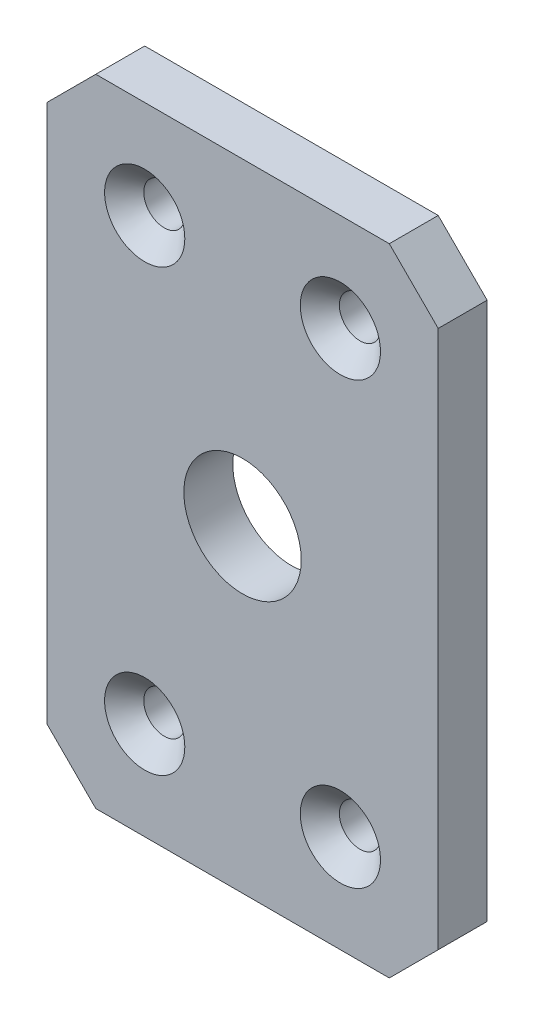
ISO-10303-21;
HEADER;
FILE_DESCRIPTION(('STEP AP214'),'2;1');
FILE_NAME('part.step','',(''),(''),'','','');
FILE_SCHEMA(('AUTOMOTIVE_DESIGN { 1 0 10303 214 1 1 1 1 }'));
ENDSEC;
DATA;
#1=APPLICATION_CONTEXT('core data for automotive mechanical design processes');
#2=APPLICATION_PROTOCOL_DEFINITION('international standard','automotive_design',2000,#1);
#3=PRODUCT_CONTEXT('',#1,'mechanical');
#4=PRODUCT('Part','Part','',(#3));
#5=PRODUCT_RELATED_PRODUCT_CATEGORY('part','',(#4));
#6=PRODUCT_DEFINITION_FORMATION('','',#4);
#7=PRODUCT_DEFINITION_CONTEXT('part definition',#1,'design');
#8=PRODUCT_DEFINITION('design','',#6,#7);
#9=PRODUCT_DEFINITION_SHAPE('','',#8);
#10=(LENGTH_UNIT() NAMED_UNIT(*) SI_UNIT(.MILLI.,.METRE.));
#11=(NAMED_UNIT(*) PLANE_ANGLE_UNIT() SI_UNIT($,.RADIAN.));
#12=(NAMED_UNIT(*) SI_UNIT($,.STERADIAN.) SOLID_ANGLE_UNIT());
#13=UNCERTAINTY_MEASURE_WITH_UNIT(LENGTH_MEASURE(1.E-05),#10,'distance_accuracy_value','');
#14=(GEOMETRIC_REPRESENTATION_CONTEXT(3) GLOBAL_UNCERTAINTY_ASSIGNED_CONTEXT((#13)) GLOBAL_UNIT_ASSIGNED_CONTEXT((#10,
#11,#12)) REPRESENTATION_CONTEXT('',''));
#15=CARTESIAN_POINT('',(0.,0.,0.));
#16=DIRECTION('',(0.,0.,1.));
#17=DIRECTION('',(1.,0.,0.));
#18=AXIS2_PLACEMENT_3D('',#15,#16,#17);
#19=CARTESIAN_POINT('',(0.,0.,2.5));
#20=DIRECTION('',(0.,0.,1.));
#21=DIRECTION('',(1.,0.,0.));
#22=AXIS2_PLACEMENT_3D('',#19,#20,#21);
#23=PLANE('',#22);
#24=CARTESIAN_POINT('',(10.,-22.5,2.5));
#25=DIRECTION('',(0.,0.,1.));
#26=DIRECTION('',(1.,0.,0.));
#27=AXIS2_PLACEMENT_3D('',#24,#25,#26);
#28=CIRCLE('',#27,4.09999999999999);
#29=CARTESIAN_POINT('',(14.1,-22.5,2.5));
#30=VERTEX_POINT('',#29);
#31=EDGE_CURVE('E162',#30,#30,#28,.F.);
#32=ORIENTED_EDGE('',*,*,#31,.T.);
#33=EDGE_LOOP('',(#32));
#34=FACE_BOUND('',#33,.T.);
#35=CARTESIAN_POINT('',(-10.,-22.5,2.5));
#36=DIRECTION('',(0.,0.,1.));
#37=DIRECTION('',(1.,0.,0.));
#38=AXIS2_PLACEMENT_3D('',#35,#36,#37);
#39=CIRCLE('',#38,4.09999999999999);
#40=CARTESIAN_POINT('',(-5.90000000000001,-22.5,2.5));
#41=VERTEX_POINT('',#40);
#42=EDGE_CURVE('E159',#41,#41,#39,.F.);
#43=ORIENTED_EDGE('',*,*,#42,.T.);
#44=EDGE_LOOP('',(#43));
#45=FACE_BOUND('',#44,.T.);
#46=CARTESIAN_POINT('',(10.,22.5,2.5));
#47=DIRECTION('',(0.,0.,1.));
#48=DIRECTION('',(1.,0.,0.));
#49=AXIS2_PLACEMENT_3D('',#46,#47,#48);
#50=CIRCLE('',#49,4.09999999999999);
#51=CARTESIAN_POINT('',(14.1,22.5,2.5));
#52=VERTEX_POINT('',#51);
#53=EDGE_CURVE('E156',#52,#52,#50,.F.);
#54=ORIENTED_EDGE('',*,*,#53,.T.);
#55=EDGE_LOOP('',(#54));
#56=FACE_BOUND('',#55,.T.);
#57=CARTESIAN_POINT('',(-10.,22.5,2.5));
#58=DIRECTION('',(0.,0.,1.));
#59=DIRECTION('',(1.,0.,0.));
#60=AXIS2_PLACEMENT_3D('',#57,#58,#59);
#61=CIRCLE('',#60,4.09999999999999);
#62=CARTESIAN_POINT('',(-5.90000000000001,22.5,2.5));
#63=VERTEX_POINT('',#62);
#64=EDGE_CURVE('E153',#63,#63,#61,.F.);
#65=ORIENTED_EDGE('',*,*,#64,.T.);
#66=EDGE_LOOP('',(#65));
#67=FACE_BOUND('',#66,.T.);
#68=DIRECTION('',(0.,1.,0.));
#69=VECTOR('',#68,1.);
#70=CARTESIAN_POINT('',(20.,-32.5,2.5));
#71=LINE('',#70,#69);
#72=CARTESIAN_POINT('',(20.,-27.5,2.5));
#73=VERTEX_POINT('',#72);
#74=CARTESIAN_POINT('',(20.,27.5,2.5));
#75=VERTEX_POINT('',#74);
#76=EDGE_CURVE('E212',#73,#75,#71,.T.);
#77=ORIENTED_EDGE('',*,*,#76,.T.);
#78=DIRECTION('',(0.707106781186546,-0.707106781186549,0.));
#79=VECTOR('',#78,1.);
#80=CARTESIAN_POINT('',(23.75,23.7499999999999,2.5));
#81=LINE('',#80,#79);
#82=CARTESIAN_POINT('',(15.,32.5,2.5));
#83=VERTEX_POINT('',#82);
#84=EDGE_CURVE('E190',#75,#83,#81,.F.);
#85=ORIENTED_EDGE('',*,*,#84,.T.);
#86=DIRECTION('',(-1.,0.,0.));
#87=VECTOR('',#86,1.);
#88=CARTESIAN_POINT('',(20.,32.5,2.5));
#89=LINE('',#88,#87);
#90=CARTESIAN_POINT('',(-15.,32.5,2.5));
#91=VERTEX_POINT('',#90);
#92=EDGE_CURVE('E124',#83,#91,#89,.T.);
#93=ORIENTED_EDGE('',*,*,#92,.T.);
#94=DIRECTION('',(0.707106781186548,0.707106781186548,0.));
#95=VECTOR('',#94,1.);
#96=CARTESIAN_POINT('',(-23.75,23.75,2.5));
#97=LINE('',#96,#95);
#98=CARTESIAN_POINT('',(-20.,27.5,2.5));
#99=VERTEX_POINT('',#98);
#100=EDGE_CURVE('E185',#91,#99,#97,.F.);
#101=ORIENTED_EDGE('',*,*,#100,.T.);
#102=DIRECTION('',(0.,-1.,0.));
#103=VECTOR('',#102,1.);
#104=CARTESIAN_POINT('',(-20.,-32.5,2.5));
#105=LINE('',#104,#103);
#106=CARTESIAN_POINT('',(-20.,-27.5,2.5));
#107=VERTEX_POINT('',#106);
#108=EDGE_CURVE('E131',#99,#107,#105,.T.);
#109=ORIENTED_EDGE('',*,*,#108,.T.);
#110=DIRECTION('',(-0.707106781186547,0.707106781186548,0.));
#111=VECTOR('',#110,1.);
#112=CARTESIAN_POINT('',(-23.75,-23.75,2.5));
#113=LINE('',#112,#111);
#114=CARTESIAN_POINT('',(-15.,-32.5,2.5));
#115=VERTEX_POINT('',#114);
#116=EDGE_CURVE('E60',#107,#115,#113,.F.);
#117=ORIENTED_EDGE('',*,*,#116,.T.);
#118=DIRECTION('',(1.,0.,0.));
#119=VECTOR('',#118,1.);
#120=CARTESIAN_POINT('',(20.,-32.5,2.5));
#121=LINE('',#120,#119);
#122=CARTESIAN_POINT('',(15.,-32.5,2.5));
#123=VERTEX_POINT('',#122);
#124=EDGE_CURVE('E134',#115,#123,#121,.T.);
#125=ORIENTED_EDGE('',*,*,#124,.T.);
#126=DIRECTION('',(-0.707106781186548,-0.707106781186547,0.));
#127=VECTOR('',#126,1.);
#128=CARTESIAN_POINT('',(23.75,-23.75,2.5));
#129=LINE('',#128,#127);
#130=EDGE_CURVE('E188',#123,#73,#129,.F.);
#131=ORIENTED_EDGE('',*,*,#130,.T.);
#132=EDGE_LOOP('',(#77,#85,#93,#101,#109,#117,#125,#131));
#133=FACE_BOUND('',#132,.T.);
#134=CARTESIAN_POINT('',(0.,0.,2.5));
#135=DIRECTION('',(0.,0.,1.));
#136=DIRECTION('',(1.,0.,0.));
#137=AXIS2_PLACEMENT_3D('',#134,#135,#136);
#138=CIRCLE('',#137,6.);
#139=CARTESIAN_POINT('',(6.,0.,2.5));
#140=VERTEX_POINT('',#139);
#141=EDGE_CURVE('E206',#140,#140,#138,.T.);
#142=ORIENTED_EDGE('',*,*,#141,.F.);
#143=EDGE_LOOP('',(#142));
#144=FACE_BOUND('',#143,.T.);
#145=ADVANCED_FACE('F37',(#34,#45,#56,#67,#133,#144),#23,.T.);
#146=CARTESIAN_POINT('',(0.,0.,-2.5));
#147=DIRECTION('',(0.,0.,1.));
#148=DIRECTION('',(1.,0.,0.));
#149=AXIS2_PLACEMENT_3D('',#146,#147,#148);
#150=PLANE('',#149);
#151=CARTESIAN_POINT('',(10.,-22.5,-2.5));
#152=DIRECTION('',(0.,0.,1.));
#153=DIRECTION('',(1.,0.,0.));
#154=AXIS2_PLACEMENT_3D('',#151,#152,#153);
#155=CIRCLE('',#154,2.1);
#156=CARTESIAN_POINT('',(12.1,-22.5,-2.5));
#157=VERTEX_POINT('',#156);
#158=EDGE_CURVE('E149',#157,#157,#155,.T.);
#159=ORIENTED_EDGE('',*,*,#158,.T.);
#160=EDGE_LOOP('',(#159));
#161=FACE_BOUND('',#160,.T.);
#162=CARTESIAN_POINT('',(-10.,-22.5,-2.5));
#163=DIRECTION('',(0.,0.,1.));
#164=DIRECTION('',(1.,0.,0.));
#165=AXIS2_PLACEMENT_3D('',#162,#163,#164);
#166=CIRCLE('',#165,2.1);
#167=CARTESIAN_POINT('',(-7.9,-22.5,-2.5));
#168=VERTEX_POINT('',#167);
#169=EDGE_CURVE('E146',#168,#168,#166,.T.);
#170=ORIENTED_EDGE('',*,*,#169,.T.);
#171=EDGE_LOOP('',(#170));
#172=FACE_BOUND('',#171,.T.);
#173=CARTESIAN_POINT('',(-10.,22.5,-2.5));
#174=DIRECTION('',(0.,0.,1.));
#175=DIRECTION('',(1.,0.,0.));
#176=AXIS2_PLACEMENT_3D('',#173,#174,#175);
#177=CIRCLE('',#176,2.1);
#178=CARTESIAN_POINT('',(-7.9,22.5,-2.5));
#179=VERTEX_POINT('',#178);
#180=EDGE_CURVE('E143',#179,#179,#177,.T.);
#181=ORIENTED_EDGE('',*,*,#180,.T.);
#182=EDGE_LOOP('',(#181));
#183=FACE_BOUND('',#182,.T.);
#184=CARTESIAN_POINT('',(10.,22.5,-2.5));
#185=DIRECTION('',(0.,0.,1.));
#186=DIRECTION('',(1.,0.,0.));
#187=AXIS2_PLACEMENT_3D('',#184,#185,#186);
#188=CIRCLE('',#187,2.1);
#189=CARTESIAN_POINT('',(12.1,22.5,-2.5));
#190=VERTEX_POINT('',#189);
#191=EDGE_CURVE('E140',#190,#190,#188,.T.);
#192=ORIENTED_EDGE('',*,*,#191,.T.);
#193=EDGE_LOOP('',(#192));
#194=FACE_BOUND('',#193,.T.);
#195=DIRECTION('',(-1.,0.,0.));
#196=VECTOR('',#195,1.);
#197=CARTESIAN_POINT('',(20.,32.5,-2.5));
#198=LINE('',#197,#196);
#199=CARTESIAN_POINT('',(15.,32.5,-2.5));
#200=VERTEX_POINT('',#199);
#201=CARTESIAN_POINT('',(-15.,32.5,-2.5));
#202=VERTEX_POINT('',#201);
#203=EDGE_CURVE('E121',#200,#202,#198,.T.);
#204=ORIENTED_EDGE('',*,*,#203,.F.);
#205=DIRECTION('',(-0.707106781186546,0.707106781186549,0.));
#206=VECTOR('',#205,1.);
#207=CARTESIAN_POINT('',(15.,32.5,-2.5));
#208=LINE('',#207,#206);
#209=CARTESIAN_POINT('',(20.,27.5,-2.5));
#210=VERTEX_POINT('',#209);
#211=EDGE_CURVE('E104',#200,#210,#208,.F.);
#212=ORIENTED_EDGE('',*,*,#211,.T.);
#213=DIRECTION('',(0.,1.,0.));
#214=VECTOR('',#213,1.);
#215=CARTESIAN_POINT('',(20.,-32.5,-2.5));
#216=LINE('',#215,#214);
#217=CARTESIAN_POINT('',(20.,-27.5,-2.5));
#218=VERTEX_POINT('',#217);
#219=EDGE_CURVE('E132',#218,#210,#216,.T.);
#220=ORIENTED_EDGE('',*,*,#219,.F.);
#221=DIRECTION('',(0.707106781186548,0.707106781186547,0.));
#222=VECTOR('',#221,1.);
#223=CARTESIAN_POINT('',(20.,-27.5,-2.5));
#224=LINE('',#223,#222);
#225=CARTESIAN_POINT('',(15.,-32.5,-2.5));
#226=VERTEX_POINT('',#225);
#227=EDGE_CURVE('E115',#218,#226,#224,.F.);
#228=ORIENTED_EDGE('',*,*,#227,.T.);
#229=DIRECTION('',(1.,0.,0.));
#230=VECTOR('',#229,1.);
#231=CARTESIAN_POINT('',(20.,-32.5,-2.5));
#232=LINE('',#231,#230);
#233=CARTESIAN_POINT('',(-15.,-32.5,-2.5));
#234=VERTEX_POINT('',#233);
#235=EDGE_CURVE('E136',#234,#226,#232,.T.);
#236=ORIENTED_EDGE('',*,*,#235,.F.);
#237=DIRECTION('',(0.707106781186547,-0.707106781186548,0.));
#238=VECTOR('',#237,1.);
#239=CARTESIAN_POINT('',(-15.,-32.5,-2.5));
#240=LINE('',#239,#238);
#241=CARTESIAN_POINT('',(-20.,-27.5,-2.5));
#242=VERTEX_POINT('',#241);
#243=EDGE_CURVE('E179',#234,#242,#240,.F.);
#244=ORIENTED_EDGE('',*,*,#243,.T.);
#245=DIRECTION('',(0.,-1.,0.));
#246=VECTOR('',#245,1.);
#247=CARTESIAN_POINT('',(-20.,-32.5,-2.5));
#248=LINE('',#247,#246);
#249=CARTESIAN_POINT('',(-20.,27.5,-2.5));
#250=VERTEX_POINT('',#249);
#251=EDGE_CURVE('E201',#250,#242,#248,.T.);
#252=ORIENTED_EDGE('',*,*,#251,.F.);
#253=DIRECTION('',(-0.707106781186548,-0.707106781186548,0.));
#254=VECTOR('',#253,1.);
#255=CARTESIAN_POINT('',(-20.,27.5,-2.5));
#256=LINE('',#255,#254);
#257=EDGE_CURVE('E125',#250,#202,#256,.F.);
#258=ORIENTED_EDGE('',*,*,#257,.T.);
#259=EDGE_LOOP('',(#204,#212,#220,#228,#236,#244,#252,#258));
#260=FACE_BOUND('',#259,.T.);
#261=CARTESIAN_POINT('',(0.,0.,-2.5));
#262=DIRECTION('',(0.,0.,1.));
#263=DIRECTION('',(1.,0.,0.));
#264=AXIS2_PLACEMENT_3D('',#261,#262,#263);
#265=CIRCLE('',#264,6.);
#266=CARTESIAN_POINT('',(6.,0.,-2.5));
#267=VERTEX_POINT('',#266);
#268=EDGE_CURVE('E152',#267,#267,#265,.T.);
#269=ORIENTED_EDGE('',*,*,#268,.T.);
#270=EDGE_LOOP('',(#269));
#271=FACE_BOUND('',#270,.T.);
#272=ADVANCED_FACE('F128',(#161,#172,#183,#194,#260,#271),#150,.F.);
#273=CARTESIAN_POINT('',(-20.,-32.5,2.5));
#274=DIRECTION('',(1.,0.,0.));
#275=DIRECTION('',(0.,0.,-1.));
#276=AXIS2_PLACEMENT_3D('',#273,#274,#275);
#277=PLANE('',#276);
#278=ORIENTED_EDGE('',*,*,#251,.T.);
#279=DIRECTION('',(0.,0.,1.));
#280=VECTOR('',#279,1.);
#281=CARTESIAN_POINT('',(-20.,-27.5,2.5));
#282=LINE('',#281,#280);
#283=EDGE_CURVE('E11',#242,#107,#282,.T.);
#284=ORIENTED_EDGE('',*,*,#283,.T.);
#285=ORIENTED_EDGE('',*,*,#108,.F.);
#286=DIRECTION('',(0.,0.,-1.));
#287=VECTOR('',#286,1.);
#288=CARTESIAN_POINT('',(-20.,27.5,2.5));
#289=LINE('',#288,#287);
#290=EDGE_CURVE('E46',#99,#250,#289,.T.);
#291=ORIENTED_EDGE('',*,*,#290,.T.);
#292=EDGE_LOOP('',(#278,#284,#285,#291));
#293=FACE_BOUND('',#292,.T.);
#294=ADVANCED_FACE('F200',(#293),#277,.F.);
#295=CARTESIAN_POINT('',(20.,-32.5,2.5));
#296=DIRECTION('',(0.,1.,0.));
#297=DIRECTION('',(-1.,0.,0.));
#298=AXIS2_PLACEMENT_3D('',#295,#296,#297);
#299=PLANE('',#298);
#300=ORIENTED_EDGE('',*,*,#235,.T.);
#301=DIRECTION('',(0.,0.,1.));
#302=VECTOR('',#301,1.);
#303=CARTESIAN_POINT('',(15.,-32.5,2.5));
#304=LINE('',#303,#302);
#305=EDGE_CURVE('E53',#226,#123,#304,.T.);
#306=ORIENTED_EDGE('',*,*,#305,.T.);
#307=ORIENTED_EDGE('',*,*,#124,.F.);
#308=DIRECTION('',(0.,0.,-1.));
#309=VECTOR('',#308,1.);
#310=CARTESIAN_POINT('',(-15.,-32.5,2.5));
#311=LINE('',#310,#309);
#312=EDGE_CURVE('E192',#115,#234,#311,.T.);
#313=ORIENTED_EDGE('',*,*,#312,.T.);
#314=EDGE_LOOP('',(#300,#306,#307,#313));
#315=FACE_BOUND('',#314,.T.);
#316=ADVANCED_FACE('F245',(#315),#299,.F.);
#317=CARTESIAN_POINT('',(20.,-32.5,2.5));
#318=DIRECTION('',(-1.,0.,0.));
#319=DIRECTION('',(0.,0.,1.));
#320=AXIS2_PLACEMENT_3D('',#317,#318,#319);
#321=PLANE('',#320);
#322=ORIENTED_EDGE('',*,*,#219,.T.);
#323=DIRECTION('',(0.,0.,1.));
#324=VECTOR('',#323,1.);
#325=CARTESIAN_POINT('',(20.,27.5,2.5));
#326=LINE('',#325,#324);
#327=EDGE_CURVE('E109',#210,#75,#326,.T.);
#328=ORIENTED_EDGE('',*,*,#327,.T.);
#329=ORIENTED_EDGE('',*,*,#76,.F.);
#330=DIRECTION('',(0.,0.,-1.));
#331=VECTOR('',#330,1.);
#332=CARTESIAN_POINT('',(20.,-27.5,2.5));
#333=LINE('',#332,#331);
#334=EDGE_CURVE('E114',#73,#218,#333,.T.);
#335=ORIENTED_EDGE('',*,*,#334,.T.);
#336=EDGE_LOOP('',(#322,#328,#329,#335));
#337=FACE_BOUND('',#336,.T.);
#338=ADVANCED_FACE('F231',(#337),#321,.F.);
#339=CARTESIAN_POINT('',(20.,32.5,2.5));
#340=DIRECTION('',(0.,-1.,0.));
#341=DIRECTION('',(1.,0.,0.));
#342=AXIS2_PLACEMENT_3D('',#339,#340,#341);
#343=PLANE('',#342);
#344=ORIENTED_EDGE('',*,*,#92,.F.);
#345=DIRECTION('',(0.,0.,-1.));
#346=VECTOR('',#345,1.);
#347=CARTESIAN_POINT('',(15.,32.5,2.5));
#348=LINE('',#347,#346);
#349=EDGE_CURVE('E108',#83,#200,#348,.T.);
#350=ORIENTED_EDGE('',*,*,#349,.T.);
#351=ORIENTED_EDGE('',*,*,#203,.T.);
#352=DIRECTION('',(0.,0.,1.));
#353=VECTOR('',#352,1.);
#354=CARTESIAN_POINT('',(-15.,32.5,2.5));
#355=LINE('',#354,#353);
#356=EDGE_CURVE('E126',#202,#91,#355,.T.);
#357=ORIENTED_EDGE('',*,*,#356,.T.);
#358=EDGE_LOOP('',(#344,#350,#351,#357));
#359=FACE_BOUND('',#358,.T.);
#360=ADVANCED_FACE('F120',(#359),#343,.F.);
#361=CARTESIAN_POINT('',(0.,0.,2.5));
#362=DIRECTION('',(0.,0.,-1.));
#363=DIRECTION('',(-1.,0.,0.));
#364=AXIS2_PLACEMENT_3D('',#361,#362,#363);
#365=CYLINDRICAL_SURFACE('',#364,6.);
#366=ORIENTED_EDGE('',*,*,#141,.T.);
#367=EDGE_LOOP('',(#366));
#368=FACE_BOUND('',#367,.T.);
#369=ORIENTED_EDGE('',*,*,#268,.F.);
#370=EDGE_LOOP('',(#369));
#371=FACE_BOUND('',#370,.T.);
#372=ADVANCED_FACE('F219',(#368,#371),#365,.F.);
#373=CARTESIAN_POINT('',(10.,22.5,2.5));
#374=DIRECTION('',(0.,0.,-1.));
#375=DIRECTION('',(-1.,0.,0.));
#376=AXIS2_PLACEMENT_3D('',#373,#374,#375);
#377=CYLINDRICAL_SURFACE('',#376,2.1);
#378=CARTESIAN_POINT('',(10.,22.5,0.500000000000007));
#379=DIRECTION('',(0.,0.,1.));
#380=DIRECTION('',(1.,0.,0.));
#381=AXIS2_PLACEMENT_3D('',#378,#379,#380);
#382=CIRCLE('',#381,2.1);
#383=CARTESIAN_POINT('',(12.1,22.5,0.500000000000007));
#384=VERTEX_POINT('',#383);
#385=EDGE_CURVE('E171',#384,#384,#382,.T.);
#386=ORIENTED_EDGE('',*,*,#385,.T.);
#387=EDGE_LOOP('',(#386));
#388=FACE_BOUND('',#387,.T.);
#389=ORIENTED_EDGE('',*,*,#191,.F.);
#390=EDGE_LOOP('',(#389));
#391=FACE_BOUND('',#390,.T.);
#392=ADVANCED_FACE('F221',(#388,#391),#377,.F.);
#393=CARTESIAN_POINT('',(-10.,22.5,2.5));
#394=DIRECTION('',(0.,0.,-1.));
#395=DIRECTION('',(-1.,0.,0.));
#396=AXIS2_PLACEMENT_3D('',#393,#394,#395);
#397=CYLINDRICAL_SURFACE('',#396,2.1);
#398=CARTESIAN_POINT('',(-10.,22.5,0.500000000000007));
#399=DIRECTION('',(0.,0.,1.));
#400=DIRECTION('',(1.,0.,0.));
#401=AXIS2_PLACEMENT_3D('',#398,#399,#400);
#402=CIRCLE('',#401,2.1);
#403=CARTESIAN_POINT('',(-7.9,22.5,0.500000000000007));
#404=VERTEX_POINT('',#403);
#405=EDGE_CURVE('E174',#404,#404,#402,.T.);
#406=ORIENTED_EDGE('',*,*,#405,.T.);
#407=EDGE_LOOP('',(#406));
#408=FACE_BOUND('',#407,.T.);
#409=ORIENTED_EDGE('',*,*,#180,.F.);
#410=EDGE_LOOP('',(#409));
#411=FACE_BOUND('',#410,.T.);
#412=ADVANCED_FACE('F228',(#408,#411),#397,.F.);
#413=CARTESIAN_POINT('',(-10.,-22.5,2.5));
#414=DIRECTION('',(0.,0.,-1.));
#415=DIRECTION('',(-1.,0.,0.));
#416=AXIS2_PLACEMENT_3D('',#413,#414,#415);
#417=CYLINDRICAL_SURFACE('',#416,2.1);
#418=CARTESIAN_POINT('',(-10.,-22.5,0.500000000000007));
#419=DIRECTION('',(0.,0.,1.));
#420=DIRECTION('',(1.,0.,0.));
#421=AXIS2_PLACEMENT_3D('',#418,#419,#420);
#422=CIRCLE('',#421,2.1);
#423=CARTESIAN_POINT('',(-7.9,-22.5,0.500000000000007));
#424=VERTEX_POINT('',#423);
#425=EDGE_CURVE('E168',#424,#424,#422,.T.);
#426=ORIENTED_EDGE('',*,*,#425,.T.);
#427=EDGE_LOOP('',(#426));
#428=FACE_BOUND('',#427,.T.);
#429=ORIENTED_EDGE('',*,*,#169,.F.);
#430=EDGE_LOOP('',(#429));
#431=FACE_BOUND('',#430,.T.);
#432=ADVANCED_FACE('F392',(#428,#431),#417,.F.);
#433=CARTESIAN_POINT('',(10.,-22.5,2.5));
#434=DIRECTION('',(0.,0.,-1.));
#435=DIRECTION('',(-1.,0.,0.));
#436=AXIS2_PLACEMENT_3D('',#433,#434,#435);
#437=CYLINDRICAL_SURFACE('',#436,2.1);
#438=CARTESIAN_POINT('',(10.,-22.5,0.500000000000007));
#439=DIRECTION('',(0.,0.,1.));
#440=DIRECTION('',(1.,0.,0.));
#441=AXIS2_PLACEMENT_3D('',#438,#439,#440);
#442=CIRCLE('',#441,2.1);
#443=CARTESIAN_POINT('',(12.1,-22.5,0.500000000000007));
#444=VERTEX_POINT('',#443);
#445=EDGE_CURVE('E165',#444,#444,#442,.T.);
#446=ORIENTED_EDGE('',*,*,#445,.T.);
#447=EDGE_LOOP('',(#446));
#448=FACE_BOUND('',#447,.T.);
#449=ORIENTED_EDGE('',*,*,#158,.F.);
#450=EDGE_LOOP('',(#449));
#451=FACE_BOUND('',#450,.T.);
#452=ADVANCED_FACE('F259',(#448,#451),#437,.F.);
#453=CARTESIAN_POINT('',(10.,-22.5,2.5));
#454=DIRECTION('',(0.,0.,1.));
#455=DIRECTION('',(1.,0.,0.));
#456=AXIS2_PLACEMENT_3D('',#453,#454,#455);
#457=CONICAL_SURFACE('',#456,4.09999999999999,0.785398163397448);
#458=ORIENTED_EDGE('',*,*,#445,.F.);
#459=EDGE_LOOP('',(#458));
#460=FACE_BOUND('',#459,.T.);
#461=ORIENTED_EDGE('',*,*,#31,.F.);
#462=EDGE_LOOP('',(#461));
#463=FACE_BOUND('',#462,.T.);
#464=ADVANCED_FACE('F252',(#460,#463),#457,.F.);
#465=CARTESIAN_POINT('',(-10.,-22.5,2.5));
#466=DIRECTION('',(0.,0.,1.));
#467=DIRECTION('',(1.,0.,0.));
#468=AXIS2_PLACEMENT_3D('',#465,#466,#467);
#469=CONICAL_SURFACE('',#468,4.09999999999999,0.785398163397448);
#470=ORIENTED_EDGE('',*,*,#425,.F.);
#471=EDGE_LOOP('',(#470));
#472=FACE_BOUND('',#471,.T.);
#473=ORIENTED_EDGE('',*,*,#42,.F.);
#474=EDGE_LOOP('',(#473));
#475=FACE_BOUND('',#474,.T.);
#476=ADVANCED_FACE('F258',(#472,#475),#469,.F.);
#477=CARTESIAN_POINT('',(10.,22.5,2.5));
#478=DIRECTION('',(0.,0.,1.));
#479=DIRECTION('',(1.,0.,0.));
#480=AXIS2_PLACEMENT_3D('',#477,#478,#479);
#481=CONICAL_SURFACE('',#480,4.09999999999999,0.785398163397448);
#482=ORIENTED_EDGE('',*,*,#385,.F.);
#483=EDGE_LOOP('',(#482));
#484=FACE_BOUND('',#483,.T.);
#485=ORIENTED_EDGE('',*,*,#53,.F.);
#486=EDGE_LOOP('',(#485));
#487=FACE_BOUND('',#486,.T.);
#488=ADVANCED_FACE('F266',(#484,#487),#481,.F.);
#489=CARTESIAN_POINT('',(-10.,22.5,2.5));
#490=DIRECTION('',(0.,0.,1.));
#491=DIRECTION('',(1.,0.,0.));
#492=AXIS2_PLACEMENT_3D('',#489,#490,#491);
#493=CONICAL_SURFACE('',#492,4.09999999999999,0.785398163397448);
#494=ORIENTED_EDGE('',*,*,#405,.F.);
#495=EDGE_LOOP('',(#494));
#496=FACE_BOUND('',#495,.T.);
#497=ORIENTED_EDGE('',*,*,#64,.F.);
#498=EDGE_LOOP('',(#497));
#499=FACE_BOUND('',#498,.T.);
#500=ADVANCED_FACE('F273',(#496,#499),#493,.F.);
#501=CARTESIAN_POINT('',(15.,32.5,2.5));
#502=DIRECTION('',(-0.707106781186549,-0.707106781186546,0.));
#503=DIRECTION('',(0.,0.,-1.));
#504=AXIS2_PLACEMENT_3D('',#501,#502,#503);
#505=PLANE('',#504);
#506=ORIENTED_EDGE('',*,*,#84,.F.);
#507=ORIENTED_EDGE('',*,*,#327,.F.);
#508=ORIENTED_EDGE('',*,*,#211,.F.);
#509=ORIENTED_EDGE('',*,*,#349,.F.);
#510=EDGE_LOOP('',(#506,#507,#508,#509));
#511=FACE_BOUND('',#510,.T.);
#512=ADVANCED_FACE('F107',(#511),#505,.F.);
#513=CARTESIAN_POINT('',(20.,-27.5,2.5));
#514=DIRECTION('',(-0.707106781186547,0.707106781186548,0.));
#515=DIRECTION('',(0.,0.,-1.));
#516=AXIS2_PLACEMENT_3D('',#513,#514,#515);
#517=PLANE('',#516);
#518=ORIENTED_EDGE('',*,*,#130,.F.);
#519=ORIENTED_EDGE('',*,*,#305,.F.);
#520=ORIENTED_EDGE('',*,*,#227,.F.);
#521=ORIENTED_EDGE('',*,*,#334,.F.);
#522=EDGE_LOOP('',(#518,#519,#520,#521));
#523=FACE_BOUND('',#522,.T.);
#524=ADVANCED_FACE('F286',(#523),#517,.F.);
#525=CARTESIAN_POINT('',(-15.,-32.5,2.5));
#526=DIRECTION('',(0.707106781186548,0.707106781186547,0.));
#527=DIRECTION('',(0.,0.,-1.));
#528=AXIS2_PLACEMENT_3D('',#525,#526,#527);
#529=PLANE('',#528);
#530=ORIENTED_EDGE('',*,*,#116,.F.);
#531=ORIENTED_EDGE('',*,*,#283,.F.);
#532=ORIENTED_EDGE('',*,*,#243,.F.);
#533=ORIENTED_EDGE('',*,*,#312,.F.);
#534=EDGE_LOOP('',(#530,#531,#532,#533));
#535=FACE_BOUND('',#534,.T.);
#536=ADVANCED_FACE('F291',(#535),#529,.F.);
#537=CARTESIAN_POINT('',(-20.,27.5,2.5));
#538=DIRECTION('',(0.707106781186548,-0.707106781186548,0.));
#539=DIRECTION('',(0.,0.,-1.));
#540=AXIS2_PLACEMENT_3D('',#537,#538,#539);
#541=PLANE('',#540);
#542=ORIENTED_EDGE('',*,*,#100,.F.);
#543=ORIENTED_EDGE('',*,*,#356,.F.);
#544=ORIENTED_EDGE('',*,*,#257,.F.);
#545=ORIENTED_EDGE('',*,*,#290,.F.);
#546=EDGE_LOOP('',(#542,#543,#544,#545));
#547=FACE_BOUND('',#546,.T.);
#548=ADVANCED_FACE('F40',(#547),#541,.F.);
#549=CLOSED_SHELL('',(#145,#272,#294,#316,#338,#360,#372,#392,#412,#432,#452,#464,#476,#488,
#500,#512,#524,#536,#548));
#550=MANIFOLD_SOLID_BREP('B2',#549);
#551=ADVANCED_BREP_SHAPE_REPRESENTATION('',(#18,#550),#14);
#552=SHAPE_DEFINITION_REPRESENTATION(#9,#551);
ENDSEC;
END-ISO-10303-21;
